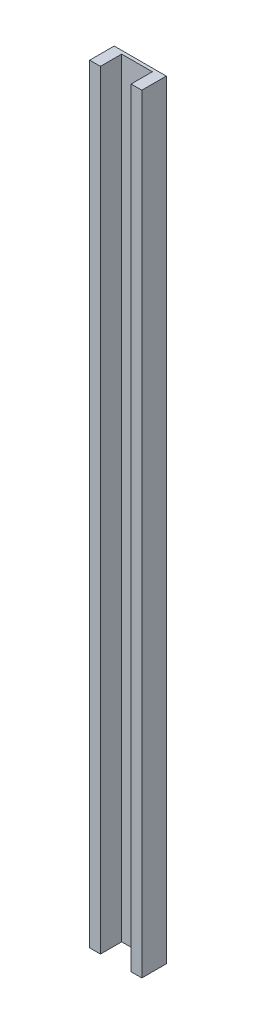
ISO-10303-21;
HEADER;
FILE_DESCRIPTION(('STEP AP214'),'2;1');
FILE_NAME('part.step','',(''),(''),'','','');
FILE_SCHEMA(('AUTOMOTIVE_DESIGN { 1 0 10303 214 1 1 1 1 }'));
ENDSEC;
DATA;
#1=APPLICATION_CONTEXT('core data for automotive mechanical design processes');
#2=APPLICATION_PROTOCOL_DEFINITION('international standard','automotive_design',2000,#1);
#3=PRODUCT_CONTEXT('',#1,'mechanical');
#4=PRODUCT('Part','Part','',(#3));
#5=PRODUCT_RELATED_PRODUCT_CATEGORY('part','',(#4));
#6=PRODUCT_DEFINITION_FORMATION('','',#4);
#7=PRODUCT_DEFINITION_CONTEXT('part definition',#1,'design');
#8=PRODUCT_DEFINITION('design','',#6,#7);
#9=PRODUCT_DEFINITION_SHAPE('','',#8);
#10=(LENGTH_UNIT() NAMED_UNIT(*) SI_UNIT(.MILLI.,.METRE.));
#11=(NAMED_UNIT(*) PLANE_ANGLE_UNIT() SI_UNIT($,.RADIAN.));
#12=(NAMED_UNIT(*) SI_UNIT($,.STERADIAN.) SOLID_ANGLE_UNIT());
#13=UNCERTAINTY_MEASURE_WITH_UNIT(LENGTH_MEASURE(1.E-05),#10,'distance_accuracy_value','');
#14=(GEOMETRIC_REPRESENTATION_CONTEXT(3) GLOBAL_UNCERTAINTY_ASSIGNED_CONTEXT((#13)) GLOBAL_UNIT_ASSIGNED_CONTEXT((#10,
#11,#12)) REPRESENTATION_CONTEXT('',''));
#15=CARTESIAN_POINT('',(0.,0.,0.));
#16=DIRECTION('',(0.,0.,1.));
#17=DIRECTION('',(1.,0.,0.));
#18=AXIS2_PLACEMENT_3D('',#15,#16,#17);
#19=CARTESIAN_POINT('',(-8.49999999999999,251.,3.99999999999999));
#20=DIRECTION('',(1.,0.,0.));
#21=DIRECTION('',(0.,0.,-1.));
#22=AXIS2_PLACEMENT_3D('',#19,#20,#21);
#23=PLANE('',#22);
#24=DIRECTION('',(0.,0.,1.));
#25=VECTOR('',#24,1.);
#26=CARTESIAN_POINT('',(-8.49999999999999,0.,3.99999999999999));
#27=LINE('',#26,#25);
#28=CARTESIAN_POINT('',(-8.49999999999999,0.,-4.00000000000001));
#29=VERTEX_POINT('',#28);
#30=CARTESIAN_POINT('',(-8.49999999999999,0.,3.99999999999999));
#31=VERTEX_POINT('',#30);
#32=EDGE_CURVE('E127',#29,#31,#27,.T.);
#33=ORIENTED_EDGE('',*,*,#32,.T.);
#34=DIRECTION('',(0.,-1.,0.));
#35=VECTOR('',#34,1.);
#36=CARTESIAN_POINT('',(-8.49999999999999,251.,3.99999999999999));
#37=LINE('',#36,#35);
#38=CARTESIAN_POINT('',(-8.49999999999999,251.,3.99999999999999));
#39=VERTEX_POINT('',#38);
#40=EDGE_CURVE('E11',#39,#31,#37,.T.);
#41=ORIENTED_EDGE('',*,*,#40,.F.);
#42=DIRECTION('',(0.,0.,1.));
#43=VECTOR('',#42,1.);
#44=CARTESIAN_POINT('',(-8.49999999999999,251.,3.99999999999999));
#45=LINE('',#44,#43);
#46=CARTESIAN_POINT('',(-8.49999999999999,251.,-4.00000000000001));
#47=VERTEX_POINT('',#46);
#48=EDGE_CURVE('E141',#47,#39,#45,.T.);
#49=ORIENTED_EDGE('',*,*,#48,.F.);
#50=DIRECTION('',(0.,-1.,0.));
#51=VECTOR('',#50,1.);
#52=CARTESIAN_POINT('',(-8.49999999999999,251.,-4.00000000000001));
#53=LINE('',#52,#51);
#54=EDGE_CURVE('E123',#47,#29,#53,.T.);
#55=ORIENTED_EDGE('',*,*,#54,.T.);
#56=EDGE_LOOP('',(#33,#41,#49,#55));
#57=FACE_BOUND('',#56,.T.);
#58=ADVANCED_FACE('F31',(#57),#23,.F.);
#59=CARTESIAN_POINT('',(-5.,251.,3.99999999999999));
#60=DIRECTION('',(0.,0.,-1.));
#61=DIRECTION('',(-1.,0.,0.));
#62=AXIS2_PLACEMENT_3D('',#59,#60,#61);
#63=PLANE('',#62);
#64=DIRECTION('',(1.,0.,0.));
#65=VECTOR('',#64,1.);
#66=CARTESIAN_POINT('',(-5.,0.,3.99999999999999));
#67=LINE('',#66,#65);
#68=CARTESIAN_POINT('',(-5.,0.,3.99999999999999));
#69=VERTEX_POINT('',#68);
#70=EDGE_CURVE('E130',#31,#69,#67,.T.);
#71=ORIENTED_EDGE('',*,*,#70,.T.);
#72=DIRECTION('',(0.,-1.,0.));
#73=VECTOR('',#72,1.);
#74=CARTESIAN_POINT('',(-5.,251.,3.99999999999999));
#75=LINE('',#74,#73);
#76=CARTESIAN_POINT('',(-5.,251.,3.99999999999999));
#77=VERTEX_POINT('',#76);
#78=EDGE_CURVE('E39',#77,#69,#75,.T.);
#79=ORIENTED_EDGE('',*,*,#78,.F.);
#80=DIRECTION('',(1.,0.,0.));
#81=VECTOR('',#80,1.);
#82=CARTESIAN_POINT('',(-5.,251.,3.99999999999999));
#83=LINE('',#82,#81);
#84=EDGE_CURVE('E90',#39,#77,#83,.T.);
#85=ORIENTED_EDGE('',*,*,#84,.F.);
#86=ORIENTED_EDGE('',*,*,#40,.T.);
#87=EDGE_LOOP('',(#71,#79,#85,#86));
#88=FACE_BOUND('',#87,.T.);
#89=ADVANCED_FACE('F176',(#88),#63,.F.);
#90=CARTESIAN_POINT('',(-5.,251.,3.99999999999999));
#91=DIRECTION('',(-1.,0.,0.));
#92=DIRECTION('',(0.,0.,1.));
#93=AXIS2_PLACEMENT_3D('',#90,#91,#92);
#94=PLANE('',#93);
#95=DIRECTION('',(0.,0.,-1.));
#96=VECTOR('',#95,1.);
#97=CARTESIAN_POINT('',(-5.,0.,3.99999999999999));
#98=LINE('',#97,#96);
#99=CARTESIAN_POINT('',(-5.,0.,-2.93875637481425));
#100=VERTEX_POINT('',#99);
#101=EDGE_CURVE('E132',#69,#100,#98,.T.);
#102=ORIENTED_EDGE('',*,*,#101,.T.);
#103=DIRECTION('',(0.,-1.,0.));
#104=VECTOR('',#103,1.);
#105=CARTESIAN_POINT('',(-5.,251.,-2.93875637481425));
#106=LINE('',#105,#104);
#107=CARTESIAN_POINT('',(-5.,251.,-2.93875637481425));
#108=VERTEX_POINT('',#107);
#109=EDGE_CURVE('E148',#108,#100,#106,.T.);
#110=ORIENTED_EDGE('',*,*,#109,.F.);
#111=DIRECTION('',(0.,0.,-1.));
#112=VECTOR('',#111,1.);
#113=CARTESIAN_POINT('',(-5.,251.,3.99999999999999));
#114=LINE('',#113,#112);
#115=EDGE_CURVE('E156',#77,#108,#114,.T.);
#116=ORIENTED_EDGE('',*,*,#115,.F.);
#117=ORIENTED_EDGE('',*,*,#78,.T.);
#118=EDGE_LOOP('',(#102,#110,#116,#117));
#119=FACE_BOUND('',#118,.T.);
#120=ADVANCED_FACE('F154',(#119),#94,.F.);
#121=CARTESIAN_POINT('',(-5.,251.,-2.93875637481425));
#122=DIRECTION('',(0.,0.,-1.));
#123=DIRECTION('',(-1.,0.,0.));
#124=AXIS2_PLACEMENT_3D('',#121,#122,#123);
#125=PLANE('',#124);
#126=DIRECTION('',(1.,0.,0.));
#127=VECTOR('',#126,1.);
#128=CARTESIAN_POINT('',(-5.,0.,-2.93875637481425));
#129=LINE('',#128,#127);
#130=CARTESIAN_POINT('',(5.,0.,-2.93875637481425));
#131=VERTEX_POINT('',#130);
#132=EDGE_CURVE('E134',#100,#131,#129,.T.);
#133=ORIENTED_EDGE('',*,*,#132,.T.);
#134=DIRECTION('',(0.,-1.,0.));
#135=VECTOR('',#134,1.);
#136=CARTESIAN_POINT('',(5.,251.,-2.93875637481425));
#137=LINE('',#136,#135);
#138=CARTESIAN_POINT('',(5.,251.,-2.93875637481425));
#139=VERTEX_POINT('',#138);
#140=EDGE_CURVE('E145',#139,#131,#137,.T.);
#141=ORIENTED_EDGE('',*,*,#140,.F.);
#142=DIRECTION('',(1.,0.,0.));
#143=VECTOR('',#142,1.);
#144=CARTESIAN_POINT('',(-5.,251.,-2.93875637481425));
#145=LINE('',#144,#143);
#146=EDGE_CURVE('E168',#108,#139,#145,.T.);
#147=ORIENTED_EDGE('',*,*,#146,.F.);
#148=ORIENTED_EDGE('',*,*,#109,.T.);
#149=EDGE_LOOP('',(#133,#141,#147,#148));
#150=FACE_BOUND('',#149,.T.);
#151=ADVANCED_FACE('F164',(#150),#125,.F.);
#152=CARTESIAN_POINT('',(5.,251.,-2.93875637481425));
#153=DIRECTION('',(1.,0.,0.));
#154=DIRECTION('',(0.,0.,-1.));
#155=AXIS2_PLACEMENT_3D('',#152,#153,#154);
#156=PLANE('',#155);
#157=DIRECTION('',(0.,0.,1.));
#158=VECTOR('',#157,1.);
#159=CARTESIAN_POINT('',(5.,0.,-2.93875637481425));
#160=LINE('',#159,#158);
#161=CARTESIAN_POINT('',(5.00000000000001,0.,3.99999999999998));
#162=VERTEX_POINT('',#161);
#163=EDGE_CURVE('E136',#131,#162,#160,.T.);
#164=ORIENTED_EDGE('',*,*,#163,.T.);
#165=DIRECTION('',(0.,-1.,0.));
#166=VECTOR('',#165,1.);
#167=CARTESIAN_POINT('',(5.00000000000001,251.,3.99999999999998));
#168=LINE('',#167,#166);
#169=CARTESIAN_POINT('',(5.00000000000001,251.,3.99999999999998));
#170=VERTEX_POINT('',#169);
#171=EDGE_CURVE('E118',#170,#162,#168,.T.);
#172=ORIENTED_EDGE('',*,*,#171,.F.);
#173=DIRECTION('',(0.,0.,1.));
#174=VECTOR('',#173,1.);
#175=CARTESIAN_POINT('',(5.,251.,-2.93875637481425));
#176=LINE('',#175,#174);
#177=EDGE_CURVE('E109',#139,#170,#176,.T.);
#178=ORIENTED_EDGE('',*,*,#177,.F.);
#179=ORIENTED_EDGE('',*,*,#140,.T.);
#180=EDGE_LOOP('',(#164,#172,#178,#179));
#181=FACE_BOUND('',#180,.T.);
#182=ADVANCED_FACE('F167',(#181),#156,.F.);
#183=CARTESIAN_POINT('',(8.50000000000001,251.,3.99999999999999));
#184=DIRECTION('',(0.,0.,-1.));
#185=DIRECTION('',(-1.,0.,0.));
#186=AXIS2_PLACEMENT_3D('',#183,#184,#185);
#187=PLANE('',#186);
#188=DIRECTION('',(1.,0.,0.));
#189=VECTOR('',#188,1.);
#190=CARTESIAN_POINT('',(8.50000000000001,0.,3.99999999999999));
#191=LINE('',#190,#189);
#192=CARTESIAN_POINT('',(8.50000000000001,0.,3.99999999999999));
#193=VERTEX_POINT('',#192);
#194=EDGE_CURVE('E117',#162,#193,#191,.T.);
#195=ORIENTED_EDGE('',*,*,#194,.T.);
#196=DIRECTION('',(0.,-1.,0.));
#197=VECTOR('',#196,1.);
#198=CARTESIAN_POINT('',(8.50000000000001,251.,3.99999999999999));
#199=LINE('',#198,#197);
#200=CARTESIAN_POINT('',(8.50000000000001,251.,3.99999999999999));
#201=VERTEX_POINT('',#200);
#202=EDGE_CURVE('E114',#201,#193,#199,.T.);
#203=ORIENTED_EDGE('',*,*,#202,.F.);
#204=DIRECTION('',(1.,0.,0.));
#205=VECTOR('',#204,1.);
#206=CARTESIAN_POINT('',(8.50000000000001,251.,3.99999999999999));
#207=LINE('',#206,#205);
#208=EDGE_CURVE('E103',#170,#201,#207,.T.);
#209=ORIENTED_EDGE('',*,*,#208,.F.);
#210=ORIENTED_EDGE('',*,*,#171,.T.);
#211=EDGE_LOOP('',(#195,#203,#209,#210));
#212=FACE_BOUND('',#211,.T.);
#213=ADVANCED_FACE('F115',(#212),#187,.F.);
#214=CARTESIAN_POINT('',(8.50000000000001,251.,3.99999999999999));
#215=DIRECTION('',(-1.,0.,0.));
#216=DIRECTION('',(0.,0.,1.));
#217=AXIS2_PLACEMENT_3D('',#214,#215,#216);
#218=PLANE('',#217);
#219=DIRECTION('',(0.,0.,-1.));
#220=VECTOR('',#219,1.);
#221=CARTESIAN_POINT('',(8.50000000000001,0.,3.99999999999999));
#222=LINE('',#221,#220);
#223=CARTESIAN_POINT('',(8.50000000000001,0.,-4.00000000000001));
#224=VERTEX_POINT('',#223);
#225=EDGE_CURVE('E76',#193,#224,#222,.T.);
#226=ORIENTED_EDGE('',*,*,#225,.T.);
#227=DIRECTION('',(0.,-1.,0.));
#228=VECTOR('',#227,1.);
#229=CARTESIAN_POINT('',(8.50000000000001,251.,-4.00000000000001));
#230=LINE('',#229,#228);
#231=CARTESIAN_POINT('',(8.50000000000001,251.,-4.00000000000001));
#232=VERTEX_POINT('',#231);
#233=EDGE_CURVE('E119',#232,#224,#230,.T.);
#234=ORIENTED_EDGE('',*,*,#233,.F.);
#235=DIRECTION('',(0.,0.,-1.));
#236=VECTOR('',#235,1.);
#237=CARTESIAN_POINT('',(8.50000000000001,251.,3.99999999999999));
#238=LINE('',#237,#236);
#239=EDGE_CURVE('E107',#201,#232,#238,.T.);
#240=ORIENTED_EDGE('',*,*,#239,.F.);
#241=ORIENTED_EDGE('',*,*,#202,.T.);
#242=EDGE_LOOP('',(#226,#234,#240,#241));
#243=FACE_BOUND('',#242,.T.);
#244=ADVANCED_FACE('F121',(#243),#218,.F.);
#245=CARTESIAN_POINT('',(8.50000000000001,251.,-4.00000000000001));
#246=DIRECTION('',(0.,0.,1.));
#247=DIRECTION('',(1.,0.,0.));
#248=AXIS2_PLACEMENT_3D('',#245,#246,#247);
#249=PLANE('',#248);
#250=DIRECTION('',(-1.,0.,0.));
#251=VECTOR('',#250,1.);
#252=CARTESIAN_POINT('',(8.50000000000001,0.,-4.00000000000001));
#253=LINE('',#252,#251);
#254=EDGE_CURVE('E82',#224,#29,#253,.T.);
#255=ORIENTED_EDGE('',*,*,#254,.T.);
#256=ORIENTED_EDGE('',*,*,#54,.F.);
#257=DIRECTION('',(-1.,0.,0.));
#258=VECTOR('',#257,1.);
#259=CARTESIAN_POINT('',(8.50000000000001,251.,-4.00000000000001));
#260=LINE('',#259,#258);
#261=EDGE_CURVE('E47',#232,#47,#260,.T.);
#262=ORIENTED_EDGE('',*,*,#261,.F.);
#263=ORIENTED_EDGE('',*,*,#233,.T.);
#264=EDGE_LOOP('',(#255,#256,#262,#263));
#265=FACE_BOUND('',#264,.T.);
#266=ADVANCED_FACE('F192',(#265),#249,.F.);
#267=CARTESIAN_POINT('',(-8.49999999999999,251.,-4.00000000000001));
#268=DIRECTION('',(0.,1.,0.));
#269=DIRECTION('',(0.,0.,1.));
#270=AXIS2_PLACEMENT_3D('',#267,#268,#269);
#271=PLANE('',#270);
#272=ORIENTED_EDGE('',*,*,#48,.T.);
#273=ORIENTED_EDGE('',*,*,#84,.T.);
#274=ORIENTED_EDGE('',*,*,#115,.T.);
#275=ORIENTED_EDGE('',*,*,#146,.T.);
#276=ORIENTED_EDGE('',*,*,#177,.T.);
#277=ORIENTED_EDGE('',*,*,#208,.T.);
#278=ORIENTED_EDGE('',*,*,#239,.T.);
#279=ORIENTED_EDGE('',*,*,#261,.T.);
#280=EDGE_LOOP('',(#272,#273,#274,#275,#276,#277,#278,#279));
#281=FACE_BOUND('',#280,.T.);
#282=ADVANCED_FACE('F105',(#281),#271,.T.);
#283=CARTESIAN_POINT('',(-8.49999999999999,0.,-4.00000000000001));
#284=DIRECTION('',(0.,1.,0.));
#285=DIRECTION('',(0.,0.,1.));
#286=AXIS2_PLACEMENT_3D('',#283,#284,#285);
#287=PLANE('',#286);
#288=ORIENTED_EDGE('',*,*,#32,.F.);
#289=ORIENTED_EDGE('',*,*,#254,.F.);
#290=ORIENTED_EDGE('',*,*,#225,.F.);
#291=ORIENTED_EDGE('',*,*,#194,.F.);
#292=ORIENTED_EDGE('',*,*,#163,.F.);
#293=ORIENTED_EDGE('',*,*,#132,.F.);
#294=ORIENTED_EDGE('',*,*,#101,.F.);
#295=ORIENTED_EDGE('',*,*,#70,.F.);
#296=EDGE_LOOP('',(#288,#289,#290,#291,#292,#293,#294,#295));
#297=FACE_BOUND('',#296,.T.);
#298=ADVANCED_FACE('F160',(#297),#287,.F.);
#299=CLOSED_SHELL('',(#58,#89,#120,#151,#182,#213,#244,#266,#282,#298));
#300=MANIFOLD_SOLID_BREP('B2',#299);
#301=ADVANCED_BREP_SHAPE_REPRESENTATION('',(#18,#300),#14);
#302=SHAPE_DEFINITION_REPRESENTATION(#9,#301);
ENDSEC;
END-ISO-10303-21;
